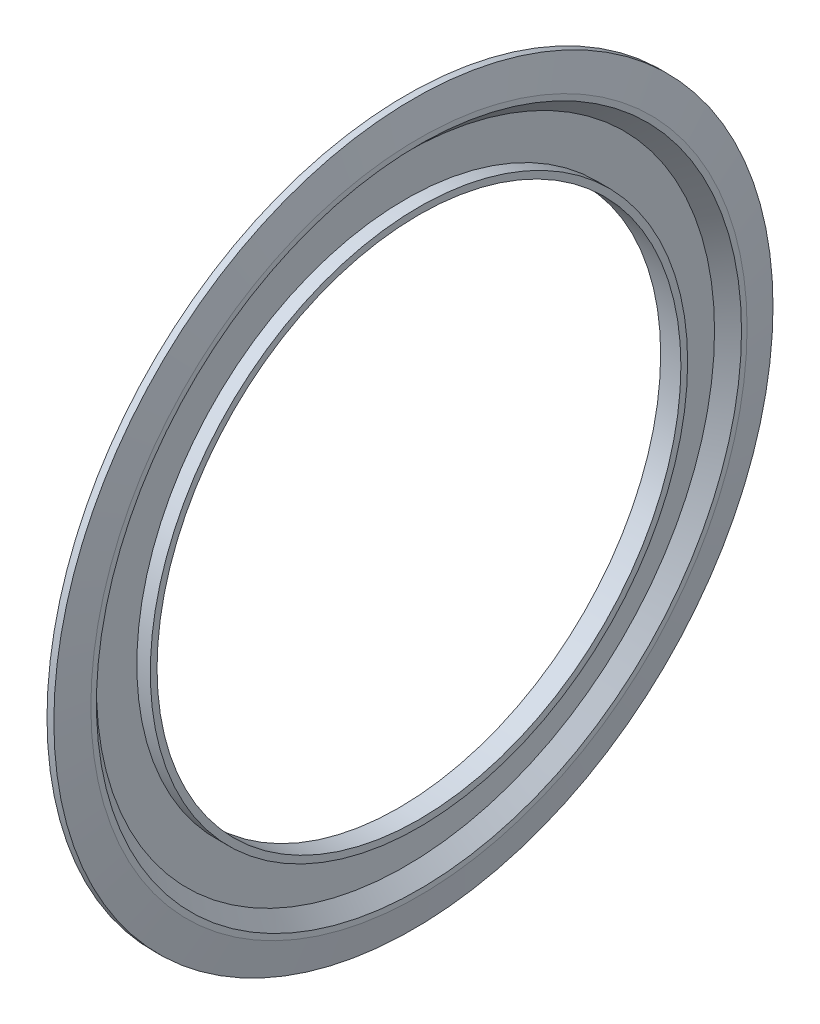
ISO-10303-21;
HEADER;
FILE_DESCRIPTION(('STEP AP214'),'2;1');
FILE_NAME('part.step','',(''),(''),'','','');
FILE_SCHEMA(('AUTOMOTIVE_DESIGN { 1 0 10303 214 1 1 1 1 }'));
ENDSEC;
DATA;
#1=APPLICATION_CONTEXT('core data for automotive mechanical design processes');
#2=APPLICATION_PROTOCOL_DEFINITION('international standard','automotive_design',2000,#1);
#3=PRODUCT_CONTEXT('',#1,'mechanical');
#4=PRODUCT('Part','Part','',(#3));
#5=PRODUCT_RELATED_PRODUCT_CATEGORY('part','',(#4));
#6=PRODUCT_DEFINITION_FORMATION('','',#4);
#7=PRODUCT_DEFINITION_CONTEXT('part definition',#1,'design');
#8=PRODUCT_DEFINITION('design','',#6,#7);
#9=PRODUCT_DEFINITION_SHAPE('','',#8);
#10=(LENGTH_UNIT() NAMED_UNIT(*) SI_UNIT(.MILLI.,.METRE.));
#11=(NAMED_UNIT(*) PLANE_ANGLE_UNIT() SI_UNIT($,.RADIAN.));
#12=(NAMED_UNIT(*) SI_UNIT($,.STERADIAN.) SOLID_ANGLE_UNIT());
#13=UNCERTAINTY_MEASURE_WITH_UNIT(LENGTH_MEASURE(1.E-05),#10,'distance_accuracy_value','');
#14=(GEOMETRIC_REPRESENTATION_CONTEXT(3) GLOBAL_UNCERTAINTY_ASSIGNED_CONTEXT((#13)) GLOBAL_UNIT_ASSIGNED_CONTEXT((#10,
#11,#12)) REPRESENTATION_CONTEXT('',''));
#15=CARTESIAN_POINT('',(0.,0.,0.));
#16=DIRECTION('',(0.,0.,1.));
#17=DIRECTION('',(1.,0.,0.));
#18=AXIS2_PLACEMENT_3D('',#15,#16,#17);
#19=CARTESIAN_POINT('',(1.17364817766693,0.,0.));
#20=DIRECTION('',(-1.,0.,0.));
#21=DIRECTION('',(0.,0.,1.));
#22=AXIS2_PLACEMENT_3D('',#19,#20,#21);
#23=CONICAL_SURFACE('',#22,14.6,1.39626340159546);
#24=CARTESIAN_POINT('',(0.92679040467508,0.,0.));
#25=DIRECTION('',(1.,0.,0.));
#26=DIRECTION('',(0.,0.,-1.));
#27=AXIS2_PLACEMENT_3D('',#24,#25,#26);
#28=CIRCLE('',#27,16.);
#29=CARTESIAN_POINT('',(0.926790404675082,0.,-16.));
#30=VERTEX_POINT('',#29);
#31=EDGE_CURVE('E71',#30,#30,#28,.T.);
#32=ORIENTED_EDGE('',*,*,#31,.T.);
#33=EDGE_LOOP('',(#32));
#34=FACE_BOUND('',#33,.T.);
#35=CARTESIAN_POINT('',(1.17364817766693,0.,0.));
#36=DIRECTION('',(1.,0.,0.));
#37=DIRECTION('',(0.,0.,-1.));
#38=AXIS2_PLACEMENT_3D('',#35,#36,#37);
#39=CIRCLE('',#38,14.6);
#40=CARTESIAN_POINT('',(1.17364817766693,0.,-14.6));
#41=VERTEX_POINT('',#40);
#42=EDGE_CURVE('E10',#41,#41,#39,.T.);
#43=ORIENTED_EDGE('',*,*,#42,.F.);
#44=EDGE_LOOP('',(#43));
#45=FACE_BOUND('',#44,.T.);
#46=ADVANCED_FACE('F14',(#34,#45),#23,.T.);
#47=CARTESIAN_POINT('',(1.17364817766693,14.6,0.));
#48=DIRECTION('',(-1.,0.,0.));
#49=DIRECTION('',(0.,0.,1.));
#50=AXIS2_PLACEMENT_3D('',#47,#48,#49);
#51=PLANE('',#50);
#52=CARTESIAN_POINT('',(1.17364817766693,0.,0.));
#53=DIRECTION('',(1.,0.,0.));
#54=DIRECTION('',(0.,0.,-1.));
#55=AXIS2_PLACEMENT_3D('',#52,#53,#54);
#56=CIRCLE('',#55,14.352);
#57=CARTESIAN_POINT('',(1.17364817766693,0.,-14.352));
#58=VERTEX_POINT('',#57);
#59=EDGE_CURVE('E21',#58,#58,#56,.T.);
#60=ORIENTED_EDGE('',*,*,#59,.F.);
#61=EDGE_LOOP('',(#60));
#62=FACE_BOUND('',#61,.T.);
#63=ORIENTED_EDGE('',*,*,#42,.T.);
#64=EDGE_LOOP('',(#63));
#65=FACE_BOUND('',#64,.T.);
#66=ADVANCED_FACE('F92',(#62,#65),#51,.F.);
#67=CARTESIAN_POINT('',(0.573648177666931,0.,0.));
#68=DIRECTION('',(1.,0.,0.));
#69=DIRECTION('',(0.,0.,-1.));
#70=AXIS2_PLACEMENT_3D('',#67,#68,#69);
#71=CONICAL_SURFACE('',#70,13.752,0.785398163397446);
#72=ORIENTED_EDGE('',*,*,#59,.T.);
#73=EDGE_LOOP('',(#72));
#74=FACE_BOUND('',#73,.T.);
#75=CARTESIAN_POINT('',(0.573648177666931,0.,0.));
#76=DIRECTION('',(1.,0.,0.));
#77=DIRECTION('',(0.,0.,-1.));
#78=AXIS2_PLACEMENT_3D('',#75,#76,#77);
#79=CIRCLE('',#78,13.752);
#80=CARTESIAN_POINT('',(0.573648177666933,0.,-13.752));
#81=VERTEX_POINT('',#80);
#82=EDGE_CURVE('E30',#81,#81,#79,.T.);
#83=ORIENTED_EDGE('',*,*,#82,.F.);
#84=EDGE_LOOP('',(#83));
#85=FACE_BOUND('',#84,.T.);
#86=ADVANCED_FACE('F96',(#74,#85),#71,.F.);
#87=CARTESIAN_POINT('',(0.57364817766693,11.955,0.));
#88=DIRECTION('',(1.,0.,0.));
#89=DIRECTION('',(0.,0.,-1.));
#90=AXIS2_PLACEMENT_3D('',#87,#88,#89);
#91=PLANE('',#90);
#92=ORIENTED_EDGE('',*,*,#82,.T.);
#93=EDGE_LOOP('',(#92));
#94=FACE_BOUND('',#93,.T.);
#95=CARTESIAN_POINT('',(0.57364817766693,0.,0.));
#96=DIRECTION('',(1.,0.,0.));
#97=DIRECTION('',(0.,0.,-1.));
#98=AXIS2_PLACEMENT_3D('',#95,#96,#97);
#99=CIRCLE('',#98,11.955);
#100=CARTESIAN_POINT('',(0.573648177666932,0.,-11.955));
#101=VERTEX_POINT('',#100);
#102=EDGE_CURVE('E37',#101,#101,#99,.T.);
#103=ORIENTED_EDGE('',*,*,#102,.F.);
#104=EDGE_LOOP('',(#103));
#105=FACE_BOUND('',#104,.T.);
#106=ADVANCED_FACE('F101',(#94,#105),#91,.T.);
#107=CARTESIAN_POINT('',(1.17364817766693,0.,0.));
#108=DIRECTION('',(1.,0.,0.));
#109=DIRECTION('',(0.,0.,-1.));
#110=AXIS2_PLACEMENT_3D('',#107,#108,#109);
#111=CYLINDRICAL_SURFACE('',#110,11.955);
#112=ORIENTED_EDGE('',*,*,#102,.T.);
#113=EDGE_LOOP('',(#112));
#114=FACE_BOUND('',#113,.T.);
#115=CARTESIAN_POINT('',(1.17364817766693,0.,0.));
#116=DIRECTION('',(1.,0.,0.));
#117=DIRECTION('',(0.,0.,-1.));
#118=AXIS2_PLACEMENT_3D('',#115,#116,#117);
#119=CIRCLE('',#118,11.955);
#120=CARTESIAN_POINT('',(1.17364817766693,0.,-11.955));
#121=VERTEX_POINT('',#120);
#122=EDGE_CURVE('E43',#121,#121,#119,.T.);
#123=ORIENTED_EDGE('',*,*,#122,.F.);
#124=EDGE_LOOP('',(#123));
#125=FACE_BOUND('',#124,.T.);
#126=ADVANCED_FACE('F106',(#114,#125),#111,.T.);
#127=CARTESIAN_POINT('',(1.17364817766693,11.655,0.));
#128=DIRECTION('',(1.,0.,0.));
#129=DIRECTION('',(0.,0.,-1.));
#130=AXIS2_PLACEMENT_3D('',#127,#128,#129);
#131=PLANE('',#130);
#132=ORIENTED_EDGE('',*,*,#122,.T.);
#133=EDGE_LOOP('',(#132));
#134=FACE_BOUND('',#133,.T.);
#135=CARTESIAN_POINT('',(1.17364817766693,0.,0.));
#136=DIRECTION('',(1.,0.,0.));
#137=DIRECTION('',(0.,0.,-1.));
#138=AXIS2_PLACEMENT_3D('',#135,#136,#137);
#139=CIRCLE('',#138,11.655);
#140=CARTESIAN_POINT('',(1.17364817766693,0.,-11.655));
#141=VERTEX_POINT('',#140);
#142=EDGE_CURVE('E47',#141,#141,#139,.T.);
#143=ORIENTED_EDGE('',*,*,#142,.F.);
#144=EDGE_LOOP('',(#143));
#145=FACE_BOUND('',#144,.T.);
#146=ADVANCED_FACE('F110',(#134,#145),#131,.T.);
#147=CARTESIAN_POINT('',(1.17364817766693,0.,0.));
#148=DIRECTION('',(1.,0.,0.));
#149=DIRECTION('',(0.,0.,-1.));
#150=AXIS2_PLACEMENT_3D('',#147,#148,#149);
#151=CYLINDRICAL_SURFACE('',#150,11.655);
#152=CARTESIAN_POINT('',(0.273648177666931,0.,0.));
#153=DIRECTION('',(1.,0.,0.));
#154=DIRECTION('',(0.,0.,-1.));
#155=AXIS2_PLACEMENT_3D('',#152,#153,#154);
#156=CIRCLE('',#155,11.655);
#157=CARTESIAN_POINT('',(0.273648177666932,0.,-11.655));
#158=VERTEX_POINT('',#157);
#159=EDGE_CURVE('E51',#158,#158,#156,.T.);
#160=ORIENTED_EDGE('',*,*,#159,.F.);
#161=EDGE_LOOP('',(#160));
#162=FACE_BOUND('',#161,.T.);
#163=ORIENTED_EDGE('',*,*,#142,.T.);
#164=EDGE_LOOP('',(#163));
#165=FACE_BOUND('',#164,.T.);
#166=ADVANCED_FACE('F114',(#162,#165),#151,.F.);
#167=CARTESIAN_POINT('',(0.273648177666931,11.655,0.));
#168=DIRECTION('',(1.,0.,0.));
#169=DIRECTION('',(0.,0.,-1.));
#170=AXIS2_PLACEMENT_3D('',#167,#168,#169);
#171=PLANE('',#170);
#172=CARTESIAN_POINT('',(0.273648177666931,0.,0.));
#173=DIRECTION('',(1.,0.,0.));
#174=DIRECTION('',(0.,0.,-1.));
#175=AXIS2_PLACEMENT_3D('',#172,#173,#174);
#176=CIRCLE('',#175,13.8762640687119);
#177=CARTESIAN_POINT('',(0.273648177666933,0.,-13.8762640687119));
#178=VERTEX_POINT('',#177);
#179=EDGE_CURVE('E55',#178,#178,#176,.T.);
#180=ORIENTED_EDGE('',*,*,#179,.F.);
#181=EDGE_LOOP('',(#180));
#182=FACE_BOUND('',#181,.T.);
#183=ORIENTED_EDGE('',*,*,#159,.T.);
#184=EDGE_LOOP('',(#183));
#185=FACE_BOUND('',#184,.T.);
#186=ADVANCED_FACE('F118',(#182,#185),#171,.F.);
#187=CARTESIAN_POINT('',(0.273648177666931,0.,0.));
#188=DIRECTION('',(1.,0.,0.));
#189=DIRECTION('',(0.,0.,-1.));
#190=AXIS2_PLACEMENT_3D('',#187,#188,#189);
#191=CONICAL_SURFACE('',#190,13.8762640687119,0.785398163397448);
#192=CARTESIAN_POINT('',(0.87364817766693,0.,0.));
#193=DIRECTION('',(1.,0.,0.));
#194=DIRECTION('',(0.,0.,-1.));
#195=AXIS2_PLACEMENT_3D('',#192,#193,#194);
#196=CIRCLE('',#195,14.4762640687119);
#197=CARTESIAN_POINT('',(0.873648177666932,0.,-14.4762640687119));
#198=VERTEX_POINT('',#197);
#199=EDGE_CURVE('E59',#198,#198,#196,.T.);
#200=ORIENTED_EDGE('',*,*,#199,.F.);
#201=EDGE_LOOP('',(#200));
#202=FACE_BOUND('',#201,.T.);
#203=ORIENTED_EDGE('',*,*,#179,.T.);
#204=EDGE_LOOP('',(#203));
#205=FACE_BOUND('',#204,.T.);
#206=ADVANCED_FACE('F122',(#202,#205),#191,.T.);
#207=CARTESIAN_POINT('',(0.87364817766693,14.4762640687119,0.));
#208=DIRECTION('',(1.,0.,0.));
#209=DIRECTION('',(0.,0.,-1.));
#210=AXIS2_PLACEMENT_3D('',#207,#208,#209);
#211=PLANE('',#210);
#212=CARTESIAN_POINT('',(0.87364817766693,0.,0.));
#213=DIRECTION('',(1.,0.,0.));
#214=DIRECTION('',(0.,0.,-1.));
#215=AXIS2_PLACEMENT_3D('',#212,#213,#214);
#216=CIRCLE('',#215,14.5737534009422);
#217=CARTESIAN_POINT('',(0.873648177666932,0.,-14.5737534009422));
#218=VERTEX_POINT('',#217);
#219=EDGE_CURVE('E63',#218,#218,#216,.T.);
#220=ORIENTED_EDGE('',*,*,#219,.F.);
#221=EDGE_LOOP('',(#220));
#222=FACE_BOUND('',#221,.T.);
#223=ORIENTED_EDGE('',*,*,#199,.T.);
#224=EDGE_LOOP('',(#223));
#225=FACE_BOUND('',#224,.T.);
#226=ADVANCED_FACE('F88',(#222,#225),#211,.F.);
#227=CARTESIAN_POINT('',(0.87364817766693,0.,0.));
#228=DIRECTION('',(-1.,0.,0.));
#229=DIRECTION('',(0.,0.,1.));
#230=AXIS2_PLACEMENT_3D('',#227,#228,#229);
#231=CONICAL_SURFACE('',#230,14.5737534009422,1.39626340159546);
#232=CARTESIAN_POINT('',(0.622162421109356,0.,0.));
#233=DIRECTION('',(1.,0.,0.));
#234=DIRECTION('',(0.,0.,-1.));
#235=AXIS2_PLACEMENT_3D('',#232,#233,#234);
#236=CIRCLE('',#235,16.);
#237=CARTESIAN_POINT('',(0.622162421109358,0.,-16.));
#238=VERTEX_POINT('',#237);
#239=EDGE_CURVE('E67',#238,#238,#236,.T.);
#240=ORIENTED_EDGE('',*,*,#239,.F.);
#241=EDGE_LOOP('',(#240));
#242=FACE_BOUND('',#241,.T.);
#243=ORIENTED_EDGE('',*,*,#219,.T.);
#244=EDGE_LOOP('',(#243));
#245=FACE_BOUND('',#244,.T.);
#246=ADVANCED_FACE('F81',(#242,#245),#231,.F.);
#247=CARTESIAN_POINT('',(1.17364817766693,0.,0.));
#248=DIRECTION('',(1.,0.,0.));
#249=DIRECTION('',(0.,0.,-1.));
#250=AXIS2_PLACEMENT_3D('',#247,#248,#249);
#251=CYLINDRICAL_SURFACE('',#250,16.);
#252=ORIENTED_EDGE('',*,*,#239,.T.);
#253=EDGE_LOOP('',(#252));
#254=FACE_BOUND('',#253,.T.);
#255=ORIENTED_EDGE('',*,*,#31,.F.);
#256=EDGE_LOOP('',(#255));
#257=FACE_BOUND('',#256,.T.);
#258=ADVANCED_FACE('F79',(#254,#257),#251,.T.);
#259=CLOSED_SHELL('',(#46,#66,#86,#106,#126,#146,#166,#186,#206,#226,#246,#258));
#260=MANIFOLD_SOLID_BREP('B1',#259);
#261=ADVANCED_BREP_SHAPE_REPRESENTATION('',(#18,#260),#14);
#262=SHAPE_DEFINITION_REPRESENTATION(#9,#261);
ENDSEC;
END-ISO-10303-21;
